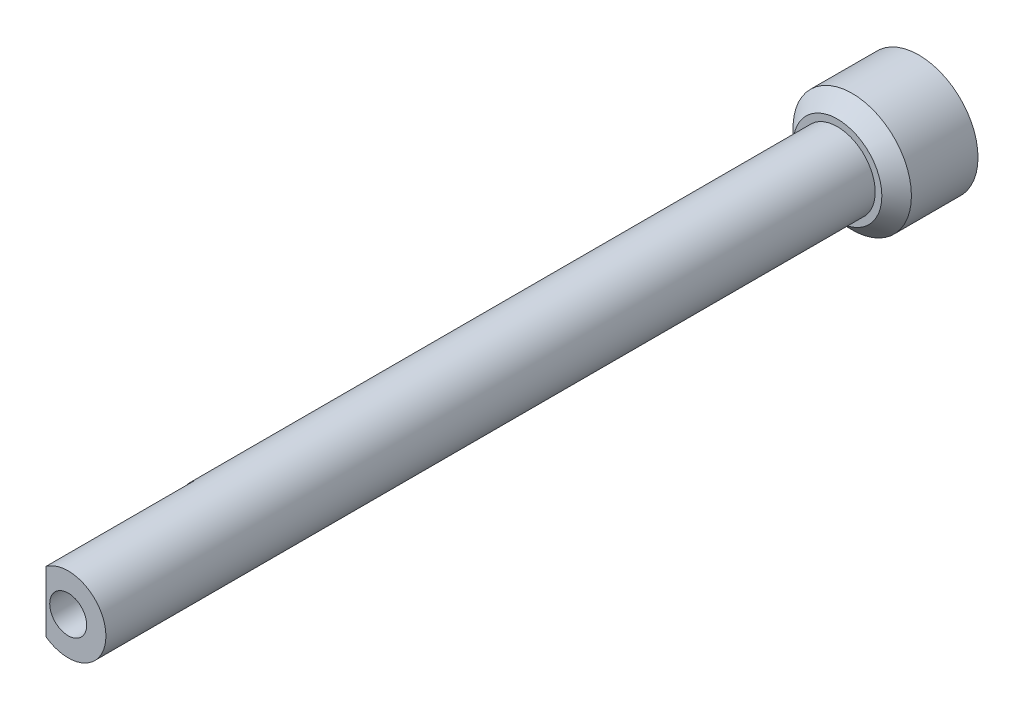
ISO-10303-21;
HEADER;
FILE_DESCRIPTION(('STEP AP214'),'2;1');
FILE_NAME('part.step','',(''),(''),'','','');
FILE_SCHEMA(('AUTOMOTIVE_DESIGN { 1 0 10303 214 1 1 1 1 }'));
ENDSEC;
DATA;
#1=APPLICATION_CONTEXT('core data for automotive mechanical design processes');
#2=APPLICATION_PROTOCOL_DEFINITION('international standard','automotive_design',2000,#1);
#3=PRODUCT_CONTEXT('',#1,'mechanical');
#4=PRODUCT('Part','Part','',(#3));
#5=PRODUCT_RELATED_PRODUCT_CATEGORY('part','',(#4));
#6=PRODUCT_DEFINITION_FORMATION('','',#4);
#7=PRODUCT_DEFINITION_CONTEXT('part definition',#1,'design');
#8=PRODUCT_DEFINITION('design','',#6,#7);
#9=PRODUCT_DEFINITION_SHAPE('','',#8);
#10=(LENGTH_UNIT() NAMED_UNIT(*) SI_UNIT(.MILLI.,.METRE.));
#11=(NAMED_UNIT(*) PLANE_ANGLE_UNIT() SI_UNIT($,.RADIAN.));
#12=(NAMED_UNIT(*) SI_UNIT($,.STERADIAN.) SOLID_ANGLE_UNIT());
#13=UNCERTAINTY_MEASURE_WITH_UNIT(LENGTH_MEASURE(1.E-05),#10,'distance_accuracy_value','');
#14=(GEOMETRIC_REPRESENTATION_CONTEXT(3) GLOBAL_UNCERTAINTY_ASSIGNED_CONTEXT((#13)) GLOBAL_UNIT_ASSIGNED_CONTEXT((#10,
#11,#12)) REPRESENTATION_CONTEXT('',''));
#15=CARTESIAN_POINT('',(0.,0.,0.));
#16=DIRECTION('',(0.,0.,1.));
#17=DIRECTION('',(1.,0.,0.));
#18=AXIS2_PLACEMENT_3D('',#15,#16,#17);
#19=CARTESIAN_POINT('',(0.,0.,-3.));
#20=DIRECTION('',(0.,0.,-1.));
#21=DIRECTION('',(-1.,0.,0.));
#22=AXIS2_PLACEMENT_3D('',#19,#20,#21);
#23=PLANE('',#22);
#24=CARTESIAN_POINT('',(0.,0.,-3.));
#25=DIRECTION('',(0.,0.,-1.));
#26=DIRECTION('',(-1.,0.,0.));
#27=AXIS2_PLACEMENT_3D('',#24,#25,#26);
#28=CIRCLE('',#27,2.5);
#29=CARTESIAN_POINT('',(-2.5,0.,-3.));
#30=VERTEX_POINT('',#29);
#31=EDGE_CURVE('E140',#30,#30,#28,.T.);
#32=ORIENTED_EDGE('',*,*,#31,.F.);
#33=EDGE_LOOP('',(#32));
#34=FACE_BOUND('',#33,.T.);
#35=CARTESIAN_POINT('',(0.,0.,-3.));
#36=DIRECTION('',(0.,0.,-1.));
#37=DIRECTION('',(-1.,0.,0.));
#38=AXIS2_PLACEMENT_3D('',#35,#36,#37);
#39=CIRCLE('',#38,2.6);
#40=CARTESIAN_POINT('',(-2.6,0.,-3.));
#41=VERTEX_POINT('',#40);
#42=EDGE_CURVE('E133',#41,#41,#39,.T.);
#43=ORIENTED_EDGE('',*,*,#42,.T.);
#44=EDGE_LOOP('',(#43));
#45=FACE_BOUND('',#44,.T.);
#46=ADVANCED_FACE('F42',(#34,#45),#23,.T.);
#47=CARTESIAN_POINT('',(0.,0.,0.));
#48=DIRECTION('',(0.,0.,-1.));
#49=DIRECTION('',(-1.,0.,0.));
#50=AXIS2_PLACEMENT_3D('',#47,#48,#49);
#51=PLANE('',#50);
#52=CARTESIAN_POINT('',(0.,0.,0.));
#53=DIRECTION('',(0.,0.,1.));
#54=DIRECTION('',(1.,0.,0.));
#55=AXIS2_PLACEMENT_3D('',#52,#53,#54);
#56=CIRCLE('',#55,2.55);
#57=CARTESIAN_POINT('',(2.55,0.,0.));
#58=VERTEX_POINT('',#57);
#59=EDGE_CURVE('E153',#58,#58,#56,.T.);
#60=ORIENTED_EDGE('',*,*,#59,.F.);
#61=EDGE_LOOP('',(#60));
#62=FACE_BOUND('',#61,.T.);
#63=CARTESIAN_POINT('',(0.,0.,0.));
#64=DIRECTION('',(0.,0.,1.));
#65=DIRECTION('',(1.,0.,0.));
#66=AXIS2_PLACEMENT_3D('',#63,#64,#65);
#67=CIRCLE('',#66,3.);
#68=CARTESIAN_POINT('',(3.,0.,0.));
#69=VERTEX_POINT('',#68);
#70=EDGE_CURVE('E130',#69,#69,#67,.T.);
#71=ORIENTED_EDGE('',*,*,#70,.T.);
#72=EDGE_LOOP('',(#71));
#73=FACE_BOUND('',#72,.T.);
#74=ADVANCED_FACE('F94',(#62,#73),#51,.F.);
#75=CARTESIAN_POINT('',(0.,0.,52.));
#76=DIRECTION('',(0.,0.,-1.));
#77=DIRECTION('',(-1.,0.,0.));
#78=AXIS2_PLACEMENT_3D('',#75,#76,#77);
#79=CYLINDRICAL_SURFACE('',#78,1.25);
#80=CARTESIAN_POINT('',(0.,0.,52.));
#81=DIRECTION('',(0.,0.,1.));
#82=DIRECTION('',(1.,0.,0.));
#83=AXIS2_PLACEMENT_3D('',#80,#81,#82);
#84=CIRCLE('',#83,1.25);
#85=CARTESIAN_POINT('',(-1.25,0.,52.));
#86=VERTEX_POINT('',#85);
#87=EDGE_CURVE('E52',#86,#86,#84,.T.);
#88=CARTESIAN_POINT('',(0.,0.,-1.2));
#89=DIRECTION('',(0.,0.,-1.));
#90=DIRECTION('',(-1.,0.,0.));
#91=AXIS2_PLACEMENT_3D('',#88,#89,#90);
#92=CIRCLE('',#91,1.25);
#93=CARTESIAN_POINT('',(-1.25,0.,-1.19999999999999));
#94=VERTEX_POINT('',#93);
#95=EDGE_CURVE('E46',#94,#94,#92,.T.);
#96=CARTESIAN_POINT('',(-1.25,0.,52.));
#97=CARTESIAN_POINT('',(-1.25,0.,51.4458333333333));
#98=CARTESIAN_POINT('',(-1.25,0.,50.8916666666667));
#99=CARTESIAN_POINT('',(-1.25,0.,49.7833333333333));
#100=CARTESIAN_POINT('',(-1.25,0.,49.2291666666667));
#101=CARTESIAN_POINT('',(-1.25,0.,48.1208333333333));
#102=CARTESIAN_POINT('',(-1.25,0.,47.5666666666667));
#103=CARTESIAN_POINT('',(-1.25,0.,46.4583333333333));
#104=CARTESIAN_POINT('',(-1.25,0.,45.9041666666667));
#105=CARTESIAN_POINT('',(-1.25,0.,44.7958333333333));
#106=CARTESIAN_POINT('',(-1.25,0.,44.2416666666667));
#107=CARTESIAN_POINT('',(-1.25,0.,43.1333333333333));
#108=CARTESIAN_POINT('',(-1.25,0.,42.5791666666667));
#109=CARTESIAN_POINT('',(-1.25,0.,41.4708333333333));
#110=CARTESIAN_POINT('',(-1.25,0.,40.9166666666667));
#111=CARTESIAN_POINT('',(-1.25,0.,39.8083333333333));
#112=CARTESIAN_POINT('',(-1.25,0.,39.2541666666667));
#113=CARTESIAN_POINT('',(-1.25,0.,38.1458333333333));
#114=CARTESIAN_POINT('',(-1.25,0.,37.5916666666667));
#115=CARTESIAN_POINT('',(-1.25,0.,36.4833333333333));
#116=CARTESIAN_POINT('',(-1.25,0.,35.9291666666667));
#117=CARTESIAN_POINT('',(-1.25,0.,34.8208333333333));
#118=CARTESIAN_POINT('',(-1.25,0.,34.2666666666667));
#119=CARTESIAN_POINT('',(-1.25,0.,33.1583333333333));
#120=CARTESIAN_POINT('',(-1.25,0.,32.6041666666667));
#121=CARTESIAN_POINT('',(-1.25,0.,31.4958333333333));
#122=CARTESIAN_POINT('',(-1.25,0.,30.9416666666667));
#123=CARTESIAN_POINT('',(-1.25,0.,29.8333333333333));
#124=CARTESIAN_POINT('',(-1.25,0.,29.2791666666667));
#125=CARTESIAN_POINT('',(-1.25,0.,28.1708333333333));
#126=CARTESIAN_POINT('',(-1.25,0.,27.6166666666667));
#127=CARTESIAN_POINT('',(-1.25,0.,26.5083333333333));
#128=CARTESIAN_POINT('',(-1.25,0.,25.9541666666667));
#129=CARTESIAN_POINT('',(-1.25,0.,24.8458333333333));
#130=CARTESIAN_POINT('',(-1.25,0.,24.2916666666667));
#131=CARTESIAN_POINT('',(-1.25,0.,23.1833333333333));
#132=CARTESIAN_POINT('',(-1.25,0.,22.6291666666667));
#133=CARTESIAN_POINT('',(-1.25,0.,21.5208333333333));
#134=CARTESIAN_POINT('',(-1.25,0.,20.9666666666667));
#135=CARTESIAN_POINT('',(-1.25,0.,19.8583333333333));
#136=CARTESIAN_POINT('',(-1.25,0.,19.3041666666667));
#137=CARTESIAN_POINT('',(-1.25,0.,18.1958333333333));
#138=CARTESIAN_POINT('',(-1.25,0.,17.6416666666667));
#139=CARTESIAN_POINT('',(-1.25,0.,16.5333333333333));
#140=CARTESIAN_POINT('',(-1.25,0.,15.9791666666667));
#141=CARTESIAN_POINT('',(-1.25,0.,14.8708333333333));
#142=CARTESIAN_POINT('',(-1.25,0.,14.3166666666667));
#143=CARTESIAN_POINT('',(-1.25,0.,13.2083333333333));
#144=CARTESIAN_POINT('',(-1.25,0.,12.6541666666667));
#145=CARTESIAN_POINT('',(-1.25,0.,11.5458333333333));
#146=CARTESIAN_POINT('',(-1.25,0.,10.9916666666667));
#147=CARTESIAN_POINT('',(-1.25,0.,9.88333333333334));
#148=CARTESIAN_POINT('',(-1.25,0.,9.32916666666667));
#149=CARTESIAN_POINT('',(-1.25,0.,8.22083333333334));
#150=CARTESIAN_POINT('',(-1.25,0.,7.66666666666667));
#151=CARTESIAN_POINT('',(-1.25,0.,6.55833333333334));
#152=CARTESIAN_POINT('',(-1.25,0.,6.00416666666668));
#153=CARTESIAN_POINT('',(-1.25,0.,4.89583333333334));
#154=CARTESIAN_POINT('',(-1.25,0.,4.34166666666667));
#155=CARTESIAN_POINT('',(-1.25,0.,3.23333333333334));
#156=CARTESIAN_POINT('',(-1.25,0.,2.67916666666667));
#157=CARTESIAN_POINT('',(-1.25,0.,1.57083333333334));
#158=CARTESIAN_POINT('',(-1.25,0.,1.01666666666667));
#159=CARTESIAN_POINT('',(-1.25,0.,-0.0916666666666612));
#160=CARTESIAN_POINT('',(-1.25,0.,-0.645833333333327));
#161=CARTESIAN_POINT('',(-1.25,0.,-1.19999999999999));
#162=B_SPLINE_CURVE_WITH_KNOTS('',3,(#96,#97,#98,#99,#100,#101,#102,#103,#104,#105,#106,#107,
#108,#109,#110,#111,#112,#113,#114,#115,#116,#117,#118,#119,#120,#121,#122,#123,#124,#125,#126,
#127,#128,#129,#130,#131,#132,#133,#134,#135,#136,#137,#138,#139,#140,#141,#142,#143,#144,#145,
#146,#147,#148,#149,#150,#151,#152,#153,#154,#155,#156,#157,#158,#159,#160,#161),.UNSPECIFIED.,
.F.,.F.,(4,2,2,2,2,2,2,2,2,2,2,2,2,2,2,2,2,2,2,2,2,2,2,2,2,2,2,2,2,2,2,2,4),(0.,1.6625,3.325,
4.9875,6.65,8.3125,9.975,11.6375,13.3,14.9625,16.625,18.2875,19.95,21.6125,23.275,24.9375,26.6,
28.2625,29.925,31.5875,33.25,34.9125,36.575,38.2375,39.9,41.5625,43.225,44.8875,46.55,48.2125,
49.875,51.5375,53.2),.UNSPECIFIED.);
#163=EDGE_CURVE('BSEAM86',#86,#94,#162,.T.);
#164=ORIENTED_EDGE('',*,*,#87,.T.);
#165=ORIENTED_EDGE('',*,*,#95,.T.);
#166=ORIENTED_EDGE('',*,*,#163,.T.);
#167=ORIENTED_EDGE('',*,*,#163,.F.);
#168=EDGE_LOOP('',(#164,#166,#165,#167));
#169=FACE_BOUND('',#168,.T.);
#170=ADVANCED_FACE('F86',(#169),#79,.F.);
#171=CARTESIAN_POINT('',(0.,0.,52.));
#172=DIRECTION('',(0.,0.,1.));
#173=DIRECTION('',(1.,0.,0.));
#174=AXIS2_PLACEMENT_3D('',#171,#172,#173);
#175=PLANE('',#174);
#176=ORIENTED_EDGE('',*,*,#87,.F.);
#177=EDGE_LOOP('',(#176));
#178=FACE_BOUND('',#177,.T.);
#179=CARTESIAN_POINT('',(0.,0.,52.));
#180=DIRECTION('',(0.,0.,1.));
#181=DIRECTION('',(1.,0.,0.));
#182=AXIS2_PLACEMENT_3D('',#179,#180,#181);
#183=CIRCLE('',#182,2.55);
#184=CARTESIAN_POINT('',(-1.5,-2.06215906273013,52.));
#185=VERTEX_POINT('',#184);
#186=CARTESIAN_POINT('',(-1.5,2.06215906273013,52.));
#187=VERTEX_POINT('',#186);
#188=EDGE_CURVE('E11',#185,#187,#183,.T.);
#189=ORIENTED_EDGE('',*,*,#188,.T.);
#190=DIRECTION('',(0.,-1.,0.));
#191=VECTOR('',#190,1.);
#192=CARTESIAN_POINT('',(-1.5,0.,52.));
#193=LINE('',#192,#191);
#194=EDGE_CURVE('E69',#187,#185,#193,.T.);
#195=ORIENTED_EDGE('',*,*,#194,.T.);
#196=EDGE_LOOP('',(#189,#195));
#197=FACE_BOUND('',#196,.T.);
#198=ADVANCED_FACE('F84',(#178,#197),#175,.T.);
#199=CARTESIAN_POINT('',(0.,0.,52.));
#200=DIRECTION('',(0.,0.,-1.));
#201=DIRECTION('',(-1.,0.,0.));
#202=AXIS2_PLACEMENT_3D('',#199,#200,#201);
#203=CYLINDRICAL_SURFACE('',#202,2.55);
#204=ORIENTED_EDGE('',*,*,#59,.T.);
#205=EDGE_LOOP('',(#204));
#206=FACE_BOUND('',#205,.T.);
#207=DIRECTION('',(0.,0.,1.));
#208=VECTOR('',#207,1.);
#209=CARTESIAN_POINT('',(-1.5,2.06215906273013,42.));
#210=LINE('',#209,#208);
#211=CARTESIAN_POINT('',(-1.5,2.06215906273013,42.));
#212=VERTEX_POINT('',#211);
#213=EDGE_CURVE('E72',#212,#187,#210,.T.);
#214=ORIENTED_EDGE('',*,*,#213,.T.);
#215=ORIENTED_EDGE('',*,*,#188,.F.);
#216=DIRECTION('',(0.,0.,1.));
#217=VECTOR('',#216,1.);
#218=CARTESIAN_POINT('',(-1.5,-2.06215906273013,42.));
#219=LINE('',#218,#217);
#220=CARTESIAN_POINT('',(-1.5,-2.06215906273013,42.));
#221=VERTEX_POINT('',#220);
#222=EDGE_CURVE('E75',#221,#185,#219,.T.);
#223=ORIENTED_EDGE('',*,*,#222,.F.);
#224=CARTESIAN_POINT('',(0.,0.,42.));
#225=DIRECTION('',(0.,0.,1.));
#226=DIRECTION('',(1.,0.,0.));
#227=AXIS2_PLACEMENT_3D('',#224,#225,#226);
#228=CIRCLE('',#227,2.55);
#229=EDGE_CURVE('E81',#212,#221,#228,.T.);
#230=ORIENTED_EDGE('',*,*,#229,.F.);
#231=EDGE_LOOP('',(#214,#215,#223,#230));
#232=FACE_BOUND('',#231,.T.);
#233=ADVANCED_FACE('F44',(#206,#232),#203,.T.);
#234=CARTESIAN_POINT('',(0.,0.,-3.));
#235=DIRECTION('',(0.,0.,1.));
#236=DIRECTION('',(1.,0.,0.));
#237=AXIS2_PLACEMENT_3D('',#234,#235,#236);
#238=CYLINDRICAL_SURFACE('',#237,4.);
#239=CARTESIAN_POINT('',(0.,0.,-1.));
#240=DIRECTION('',(0.,0.,1.));
#241=DIRECTION('',(1.,0.,0.));
#242=AXIS2_PLACEMENT_3D('',#239,#240,#241);
#243=CIRCLE('',#242,4.);
#244=CARTESIAN_POINT('',(4.,0.,-1.));
#245=VERTEX_POINT('',#244);
#246=EDGE_CURVE('E120',#245,#245,#243,.T.);
#247=ORIENTED_EDGE('',*,*,#246,.F.);
#248=EDGE_LOOP('',(#247));
#249=FACE_BOUND('',#248,.T.);
#250=CARTESIAN_POINT('',(0.,0.,-5.5));
#251=DIRECTION('',(0.,0.,-1.));
#252=DIRECTION('',(-1.,0.,0.));
#253=AXIS2_PLACEMENT_3D('',#250,#251,#252);
#254=CIRCLE('',#253,4.);
#255=CARTESIAN_POINT('',(-4.,0.,-5.5));
#256=VERTEX_POINT('',#255);
#257=EDGE_CURVE('E123',#256,#256,#254,.T.);
#258=ORIENTED_EDGE('',*,*,#257,.F.);
#259=EDGE_LOOP('',(#258));
#260=FACE_BOUND('',#259,.T.);
#261=ADVANCED_FACE('F92',(#249,#260),#238,.T.);
#262=CARTESIAN_POINT('',(-1.5,0.,42.));
#263=DIRECTION('',(-1.,0.,0.));
#264=DIRECTION('',(0.,0.,1.));
#265=AXIS2_PLACEMENT_3D('',#262,#263,#264);
#266=PLANE('',#265);
#267=ORIENTED_EDGE('',*,*,#194,.F.);
#268=ORIENTED_EDGE('',*,*,#213,.F.);
#269=DIRECTION('',(0.,-1.,0.));
#270=VECTOR('',#269,1.);
#271=CARTESIAN_POINT('',(-1.5,0.,42.));
#272=LINE('',#271,#270);
#273=EDGE_CURVE('E59',#212,#221,#272,.T.);
#274=ORIENTED_EDGE('',*,*,#273,.T.);
#275=ORIENTED_EDGE('',*,*,#222,.T.);
#276=EDGE_LOOP('',(#267,#268,#274,#275));
#277=FACE_BOUND('',#276,.T.);
#278=ADVANCED_FACE('F71',(#277),#266,.T.);
#279=CARTESIAN_POINT('',(0.,0.,42.));
#280=DIRECTION('',(0.,0.,1.));
#281=DIRECTION('',(1.,0.,0.));
#282=AXIS2_PLACEMENT_3D('',#279,#280,#281);
#283=PLANE('',#282);
#284=ORIENTED_EDGE('',*,*,#273,.F.);
#285=ORIENTED_EDGE('',*,*,#229,.T.);
#286=EDGE_LOOP('',(#284,#285));
#287=FACE_BOUND('',#286,.T.);
#288=ADVANCED_FACE('F116',(#287),#283,.T.);
#289=CARTESIAN_POINT('',(0.,0.,-1.2));
#290=DIRECTION('',(0.,0.,-1.));
#291=DIRECTION('',(-1.,0.,0.));
#292=AXIS2_PLACEMENT_3D('',#289,#290,#291);
#293=PLANE('',#292);
#294=ORIENTED_EDGE('',*,*,#95,.F.);
#295=EDGE_LOOP('',(#294));
#296=FACE_BOUND('',#295,.T.);
#297=CARTESIAN_POINT('',(0.,0.,-1.2));
#298=DIRECTION('',(0.,0.,-1.));
#299=DIRECTION('',(-1.,0.,0.));
#300=AXIS2_PLACEMENT_3D('',#297,#298,#299);
#301=CIRCLE('',#300,2.2);
#302=CARTESIAN_POINT('',(-2.2,0.,-1.2));
#303=VERTEX_POINT('',#302);
#304=EDGE_CURVE('E144',#303,#303,#301,.T.);
#305=ORIENTED_EDGE('',*,*,#304,.T.);
#306=EDGE_LOOP('',(#305));
#307=FACE_BOUND('',#306,.T.);
#308=ADVANCED_FACE('F175',(#296,#307),#293,.T.);
#309=CARTESIAN_POINT('',(0.,0.,-1.2));
#310=DIRECTION('',(0.,0.,-1.));
#311=DIRECTION('',(-1.,0.,0.));
#312=AXIS2_PLACEMENT_3D('',#309,#310,#311);
#313=CONICAL_SURFACE('',#312,2.2,0.165148677414627);
#314=ORIENTED_EDGE('',*,*,#31,.T.);
#315=EDGE_LOOP('',(#314));
#316=FACE_BOUND('',#315,.T.);
#317=ORIENTED_EDGE('',*,*,#304,.F.);
#318=EDGE_LOOP('',(#317));
#319=FACE_BOUND('',#318,.T.);
#320=ADVANCED_FACE('F167',(#316,#319),#313,.F.);
#321=CARTESIAN_POINT('',(0.,0.,-1.));
#322=DIRECTION('',(0.,0.,-1.));
#323=DIRECTION('',(-1.,0.,0.));
#324=AXIS2_PLACEMENT_3D('',#321,#322,#323);
#325=CONICAL_SURFACE('',#324,4.,0.785398163397448);
#326=ORIENTED_EDGE('',*,*,#70,.F.);
#327=EDGE_LOOP('',(#326));
#328=FACE_BOUND('',#327,.T.);
#329=ORIENTED_EDGE('',*,*,#246,.T.);
#330=EDGE_LOOP('',(#329));
#331=FACE_BOUND('',#330,.T.);
#332=ADVANCED_FACE('F163',(#328,#331),#325,.T.);
#333=CARTESIAN_POINT('',(0.,0.,-5.5));
#334=DIRECTION('',(0.,0.,-1.));
#335=DIRECTION('',(-1.,0.,0.));
#336=AXIS2_PLACEMENT_3D('',#333,#334,#335);
#337=PLANE('',#336);
#338=ORIENTED_EDGE('',*,*,#257,.T.);
#339=EDGE_LOOP('',(#338));
#340=FACE_BOUND('',#339,.T.);
#341=CARTESIAN_POINT('',(0.,0.,-5.5));
#342=DIRECTION('',(0.,0.,-1.));
#343=DIRECTION('',(-1.,0.,0.));
#344=AXIS2_PLACEMENT_3D('',#341,#342,#343);
#345=CIRCLE('',#344,2.6);
#346=CARTESIAN_POINT('',(-2.6,0.,-5.5));
#347=VERTEX_POINT('',#346);
#348=EDGE_CURVE('E126',#347,#347,#345,.T.);
#349=ORIENTED_EDGE('',*,*,#348,.F.);
#350=EDGE_LOOP('',(#349));
#351=FACE_BOUND('',#350,.T.);
#352=ADVANCED_FACE('F166',(#340,#351),#337,.T.);
#353=CARTESIAN_POINT('',(0.,0.,-5.5));
#354=DIRECTION('',(0.,0.,1.));
#355=DIRECTION('',(1.,0.,0.));
#356=AXIS2_PLACEMENT_3D('',#353,#354,#355);
#357=CYLINDRICAL_SURFACE('',#356,2.6);
#358=ORIENTED_EDGE('',*,*,#348,.T.);
#359=EDGE_LOOP('',(#358));
#360=FACE_BOUND('',#359,.T.);
#361=ORIENTED_EDGE('',*,*,#42,.F.);
#362=EDGE_LOOP('',(#361));
#363=FACE_BOUND('',#362,.T.);
#364=ADVANCED_FACE('F173',(#360,#363),#357,.F.);
#365=CLOSED_SHELL('',(#46,#74,#170,#198,#233,#261,#278,#288,#308,#320,#332,#352,#364));
#366=MANIFOLD_SOLID_BREP('B2',#365);
#367=ADVANCED_BREP_SHAPE_REPRESENTATION('',(#18,#366),#14);
#368=SHAPE_DEFINITION_REPRESENTATION(#9,#367);
ENDSEC;
END-ISO-10303-21;
